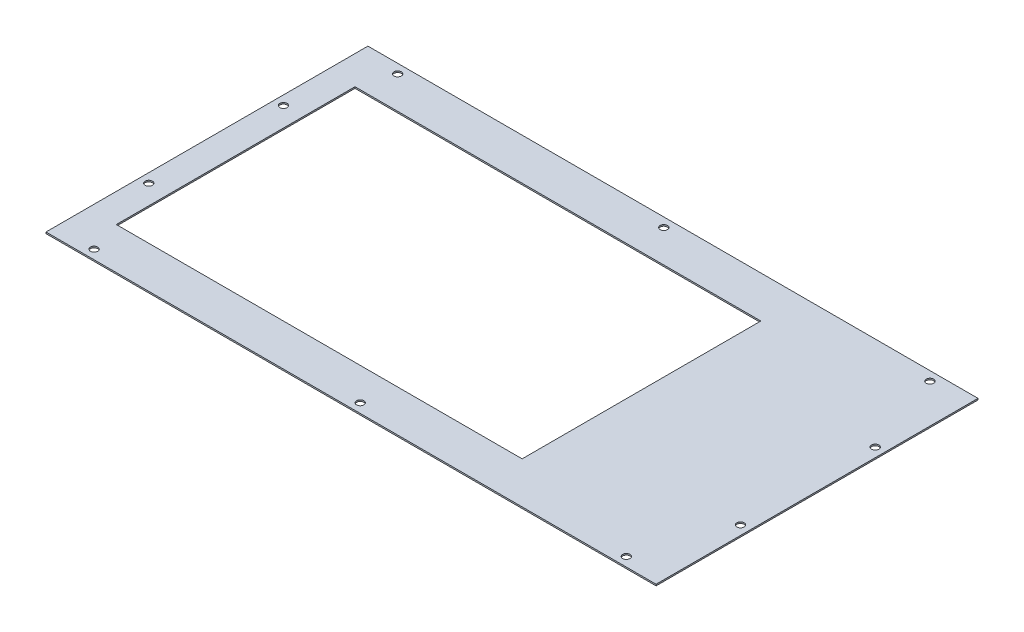
ISO-10303-21;
HEADER;
FILE_DESCRIPTION(('STEP AP214'),'2;1');
FILE_NAME('part.step','',(''),(''),'','','');
FILE_SCHEMA(('AUTOMOTIVE_DESIGN { 1 0 10303 214 1 1 1 1 }'));
ENDSEC;
DATA;
#1=APPLICATION_CONTEXT('core data for automotive mechanical design processes');
#2=APPLICATION_PROTOCOL_DEFINITION('international standard','automotive_design',2000,#1);
#3=PRODUCT_CONTEXT('',#1,'mechanical');
#4=PRODUCT('Part','Part','',(#3));
#5=PRODUCT_RELATED_PRODUCT_CATEGORY('part','',(#4));
#6=PRODUCT_DEFINITION_FORMATION('','',#4);
#7=PRODUCT_DEFINITION_CONTEXT('part definition',#1,'design');
#8=PRODUCT_DEFINITION('design','',#6,#7);
#9=PRODUCT_DEFINITION_SHAPE('','',#8);
#10=(LENGTH_UNIT() NAMED_UNIT(*) SI_UNIT(.MILLI.,.METRE.));
#11=(NAMED_UNIT(*) PLANE_ANGLE_UNIT() SI_UNIT($,.RADIAN.));
#12=(NAMED_UNIT(*) SI_UNIT($,.STERADIAN.) SOLID_ANGLE_UNIT());
#13=UNCERTAINTY_MEASURE_WITH_UNIT(LENGTH_MEASURE(1.E-05),#10,'distance_accuracy_value','');
#14=(GEOMETRIC_REPRESENTATION_CONTEXT(3) GLOBAL_UNCERTAINTY_ASSIGNED_CONTEXT((#13)) GLOBAL_UNIT_ASSIGNED_CONTEXT((#10,
#11,#12)) REPRESENTATION_CONTEXT('',''));
#15=CARTESIAN_POINT('',(0.,0.,0.));
#16=DIRECTION('',(0.,0.,1.));
#17=DIRECTION('',(1.,0.,0.));
#18=AXIS2_PLACEMENT_3D('',#15,#16,#17);
#19=CARTESIAN_POINT('',(166.2,-0.8,87.7));
#20=DIRECTION('',(1.,0.,0.));
#21=DIRECTION('',(0.,0.,-1.));
#22=AXIS2_PLACEMENT_3D('',#19,#20,#21);
#23=PLANE('',#22);
#24=DIRECTION('',(0.,0.,-1.));
#25=VECTOR('',#24,1.);
#26=CARTESIAN_POINT('',(166.2,0.,87.7));
#27=LINE('',#26,#25);
#28=CARTESIAN_POINT('',(166.2,0.,87.7));
#29=VERTEX_POINT('',#28);
#30=CARTESIAN_POINT('',(166.2,0.,-87.7));
#31=VERTEX_POINT('',#30);
#32=EDGE_CURVE('E192',#29,#31,#27,.T.);
#33=ORIENTED_EDGE('',*,*,#32,.F.);
#34=DIRECTION('',(0.,1.,0.));
#35=VECTOR('',#34,1.);
#36=CARTESIAN_POINT('',(166.2,-0.8,87.7));
#37=LINE('',#36,#35);
#38=CARTESIAN_POINT('',(166.2,-0.8,87.7));
#39=VERTEX_POINT('',#38);
#40=EDGE_CURVE('E11',#39,#29,#37,.T.);
#41=ORIENTED_EDGE('',*,*,#40,.F.);
#42=DIRECTION('',(0.,0.,-1.));
#43=VECTOR('',#42,1.);
#44=CARTESIAN_POINT('',(166.2,-0.8,87.7));
#45=LINE('',#44,#43);
#46=CARTESIAN_POINT('',(166.2,-0.8,-87.7));
#47=VERTEX_POINT('',#46);
#48=EDGE_CURVE('E195',#39,#47,#45,.T.);
#49=ORIENTED_EDGE('',*,*,#48,.T.);
#50=DIRECTION('',(0.,1.,0.));
#51=VECTOR('',#50,1.);
#52=CARTESIAN_POINT('',(166.2,-0.8,-87.7));
#53=LINE('',#52,#51);
#54=EDGE_CURVE('E37',#47,#31,#53,.T.);
#55=ORIENTED_EDGE('',*,*,#54,.T.);
#56=EDGE_LOOP('',(#33,#41,#49,#55));
#57=FACE_BOUND('',#56,.T.);
#58=ADVANCED_FACE('F34',(#57),#23,.T.);
#59=CARTESIAN_POINT('',(-166.2,-0.8,87.7));
#60=DIRECTION('',(0.,0.,1.));
#61=DIRECTION('',(1.,0.,0.));
#62=AXIS2_PLACEMENT_3D('',#59,#60,#61);
#63=PLANE('',#62);
#64=DIRECTION('',(1.,0.,0.));
#65=VECTOR('',#64,1.);
#66=CARTESIAN_POINT('',(-166.2,0.,87.7));
#67=LINE('',#66,#65);
#68=CARTESIAN_POINT('',(-166.2,0.,87.7));
#69=VERTEX_POINT('',#68);
#70=EDGE_CURVE('E199',#69,#29,#67,.T.);
#71=ORIENTED_EDGE('',*,*,#70,.F.);
#72=DIRECTION('',(0.,1.,0.));
#73=VECTOR('',#72,1.);
#74=CARTESIAN_POINT('',(-166.2,-0.8,87.7));
#75=LINE('',#74,#73);
#76=CARTESIAN_POINT('',(-166.2,-0.8,87.7));
#77=VERTEX_POINT('',#76);
#78=EDGE_CURVE('E42',#77,#69,#75,.T.);
#79=ORIENTED_EDGE('',*,*,#78,.F.);
#80=DIRECTION('',(1.,0.,0.));
#81=VECTOR('',#80,1.);
#82=CARTESIAN_POINT('',(-166.2,-0.8,87.7));
#83=LINE('',#82,#81);
#84=EDGE_CURVE('E205',#77,#39,#83,.T.);
#85=ORIENTED_EDGE('',*,*,#84,.T.);
#86=ORIENTED_EDGE('',*,*,#40,.T.);
#87=EDGE_LOOP('',(#71,#79,#85,#86));
#88=FACE_BOUND('',#87,.T.);
#89=ADVANCED_FACE('F230',(#88),#63,.T.);
#90=CARTESIAN_POINT('',(-166.2,-0.8,87.7));
#91=DIRECTION('',(-1.,0.,0.));
#92=DIRECTION('',(0.,0.,1.));
#93=AXIS2_PLACEMENT_3D('',#90,#91,#92);
#94=PLANE('',#93);
#95=DIRECTION('',(0.,0.,1.));
#96=VECTOR('',#95,1.);
#97=CARTESIAN_POINT('',(-166.2,0.,87.7));
#98=LINE('',#97,#96);
#99=CARTESIAN_POINT('',(-166.2,0.,-87.7));
#100=VERTEX_POINT('',#99);
#101=EDGE_CURVE('E213',#100,#69,#98,.T.);
#102=ORIENTED_EDGE('',*,*,#101,.F.);
#103=DIRECTION('',(0.,1.,0.));
#104=VECTOR('',#103,1.);
#105=CARTESIAN_POINT('',(-166.2,-0.8,-87.7));
#106=LINE('',#105,#104);
#107=CARTESIAN_POINT('',(-166.2,-0.8,-87.7));
#108=VERTEX_POINT('',#107);
#109=EDGE_CURVE('E218',#108,#100,#106,.T.);
#110=ORIENTED_EDGE('',*,*,#109,.F.);
#111=DIRECTION('',(0.,0.,1.));
#112=VECTOR('',#111,1.);
#113=CARTESIAN_POINT('',(-166.2,-0.8,87.7));
#114=LINE('',#113,#112);
#115=EDGE_CURVE('E202',#108,#77,#114,.T.);
#116=ORIENTED_EDGE('',*,*,#115,.T.);
#117=ORIENTED_EDGE('',*,*,#78,.T.);
#118=EDGE_LOOP('',(#102,#110,#116,#117));
#119=FACE_BOUND('',#118,.T.);
#120=ADVANCED_FACE('F236',(#119),#94,.T.);
#121=CARTESIAN_POINT('',(-166.2,-0.8,-87.7));
#122=DIRECTION('',(0.,0.,-1.));
#123=DIRECTION('',(-1.,0.,0.));
#124=AXIS2_PLACEMENT_3D('',#121,#122,#123);
#125=PLANE('',#124);
#126=DIRECTION('',(-1.,0.,0.));
#127=VECTOR('',#126,1.);
#128=CARTESIAN_POINT('',(-166.2,0.,-87.7));
#129=LINE('',#128,#127);
#130=EDGE_CURVE('E210',#31,#100,#129,.T.);
#131=ORIENTED_EDGE('',*,*,#130,.F.);
#132=ORIENTED_EDGE('',*,*,#54,.F.);
#133=DIRECTION('',(-1.,0.,0.));
#134=VECTOR('',#133,1.);
#135=CARTESIAN_POINT('',(-166.2,-0.8,-87.7));
#136=LINE('',#135,#134);
#137=EDGE_CURVE('E198',#47,#108,#136,.T.);
#138=ORIENTED_EDGE('',*,*,#137,.T.);
#139=ORIENTED_EDGE('',*,*,#109,.T.);
#140=EDGE_LOOP('',(#131,#132,#138,#139));
#141=FACE_BOUND('',#140,.T.);
#142=ADVANCED_FACE('F226',(#141),#125,.T.);
#143=CARTESIAN_POINT('',(166.2,-0.8,-87.7));
#144=DIRECTION('',(0.,-1.,0.));
#145=DIRECTION('',(0.,0.,-1.));
#146=AXIS2_PLACEMENT_3D('',#143,#144,#145);
#147=PLANE('',#146);
#148=DIRECTION('',(0.,0.,1.));
#149=VECTOR('',#148,1.);
#150=CARTESIAN_POINT('',(70.56,-0.8,-87.7));
#151=LINE('',#150,#149);
#152=CARTESIAN_POINT('',(70.56,-0.8,-65.0350000000001));
#153=VERTEX_POINT('',#152);
#154=CARTESIAN_POINT('',(70.56,-0.8,65.0349999999999));
#155=VERTEX_POINT('',#154);
#156=EDGE_CURVE('E132',#153,#155,#151,.T.);
#157=ORIENTED_EDGE('',*,*,#156,.F.);
#158=DIRECTION('',(1.,0.,0.));
#159=VECTOR('',#158,1.);
#160=CARTESIAN_POINT('',(166.2,-0.8,-65.0350000000001));
#161=LINE('',#160,#159);
#162=CARTESIAN_POINT('',(-150.56,-0.8,-65.0350000000001));
#163=VERTEX_POINT('',#162);
#164=EDGE_CURVE('E125',#163,#153,#161,.T.);
#165=ORIENTED_EDGE('',*,*,#164,.F.);
#166=DIRECTION('',(0.,0.,-1.));
#167=VECTOR('',#166,1.);
#168=CARTESIAN_POINT('',(-150.56,-0.8,-87.7));
#169=LINE('',#168,#167);
#170=CARTESIAN_POINT('',(-150.56,-0.8,65.0349999999999));
#171=VERTEX_POINT('',#170);
#172=EDGE_CURVE('E105',#171,#163,#169,.T.);
#173=ORIENTED_EDGE('',*,*,#172,.F.);
#174=DIRECTION('',(-1.,0.,0.));
#175=VECTOR('',#174,1.);
#176=CARTESIAN_POINT('',(166.2,-0.8,65.0349999999999));
#177=LINE('',#176,#175);
#178=EDGE_CURVE('E130',#155,#171,#177,.T.);
#179=ORIENTED_EDGE('',*,*,#178,.F.);
#180=EDGE_LOOP('',(#157,#165,#173,#179));
#181=FACE_BOUND('',#180,.T.);
#182=CARTESIAN_POINT('',(-161.2,-0.8,36.7));
#183=DIRECTION('',(0.,1.,0.));
#184=DIRECTION('',(0.,0.,-1.));
#185=AXIS2_PLACEMENT_3D('',#182,#183,#184);
#186=CIRCLE('',#185,2.);
#187=CARTESIAN_POINT('',(-161.2,-0.8,34.7));
#188=VERTEX_POINT('',#187);
#189=EDGE_CURVE('E135',#188,#188,#186,.T.);
#190=ORIENTED_EDGE('',*,*,#189,.T.);
#191=EDGE_LOOP('',(#190));
#192=FACE_BOUND('',#191,.T.);
#193=CARTESIAN_POINT('',(-145.,-0.8,82.7));
#194=DIRECTION('',(0.,1.,0.));
#195=DIRECTION('',(0.,0.,-1.));
#196=AXIS2_PLACEMENT_3D('',#193,#194,#195);
#197=CIRCLE('',#196,2.);
#198=CARTESIAN_POINT('',(-145.,-0.8,80.7));
#199=VERTEX_POINT('',#198);
#200=EDGE_CURVE('E141',#199,#199,#197,.T.);
#201=ORIENTED_EDGE('',*,*,#200,.T.);
#202=EDGE_LOOP('',(#201));
#203=FACE_BOUND('',#202,.T.);
#204=CARTESIAN_POINT('',(0.,-0.8,82.7));
#205=DIRECTION('',(0.,1.,0.));
#206=DIRECTION('',(0.,0.,-1.));
#207=AXIS2_PLACEMENT_3D('',#204,#205,#206);
#208=CIRCLE('',#207,2.);
#209=CARTESIAN_POINT('',(0.,-0.8,80.7));
#210=VERTEX_POINT('',#209);
#211=EDGE_CURVE('E147',#210,#210,#208,.T.);
#212=ORIENTED_EDGE('',*,*,#211,.T.);
#213=EDGE_LOOP('',(#212));
#214=FACE_BOUND('',#213,.T.);
#215=CARTESIAN_POINT('',(145.,-0.8,82.7));
#216=DIRECTION('',(0.,1.,0.));
#217=DIRECTION('',(0.,0.,-1.));
#218=AXIS2_PLACEMENT_3D('',#215,#216,#217);
#219=CIRCLE('',#218,2.);
#220=CARTESIAN_POINT('',(145.,-0.8,80.7));
#221=VERTEX_POINT('',#220);
#222=EDGE_CURVE('E153',#221,#221,#219,.T.);
#223=ORIENTED_EDGE('',*,*,#222,.T.);
#224=EDGE_LOOP('',(#223));
#225=FACE_BOUND('',#224,.T.);
#226=CARTESIAN_POINT('',(161.2,-0.8,36.7));
#227=DIRECTION('',(0.,1.,0.));
#228=DIRECTION('',(0.,0.,1.));
#229=AXIS2_PLACEMENT_3D('',#226,#227,#228);
#230=CIRCLE('',#229,2.);
#231=CARTESIAN_POINT('',(161.2,-0.8,38.7));
#232=VERTEX_POINT('',#231);
#233=EDGE_CURVE('E159',#232,#232,#230,.T.);
#234=ORIENTED_EDGE('',*,*,#233,.T.);
#235=EDGE_LOOP('',(#234));
#236=FACE_BOUND('',#235,.T.);
#237=CARTESIAN_POINT('',(161.2,-0.8,-36.7));
#238=DIRECTION('',(0.,1.,0.));
#239=DIRECTION('',(0.,0.,-1.));
#240=AXIS2_PLACEMENT_3D('',#237,#238,#239);
#241=CIRCLE('',#240,2.);
#242=CARTESIAN_POINT('',(161.2,-0.8,-38.7));
#243=VERTEX_POINT('',#242);
#244=EDGE_CURVE('E165',#243,#243,#241,.T.);
#245=ORIENTED_EDGE('',*,*,#244,.T.);
#246=EDGE_LOOP('',(#245));
#247=FACE_BOUND('',#246,.T.);
#248=CARTESIAN_POINT('',(-161.2,-0.8,-36.7));
#249=DIRECTION('',(0.,1.,0.));
#250=DIRECTION('',(0.,0.,1.));
#251=AXIS2_PLACEMENT_3D('',#248,#249,#250);
#252=CIRCLE('',#251,2.);
#253=CARTESIAN_POINT('',(-161.2,-0.8,-34.7));
#254=VERTEX_POINT('',#253);
#255=EDGE_CURVE('E171',#254,#254,#252,.T.);
#256=ORIENTED_EDGE('',*,*,#255,.T.);
#257=EDGE_LOOP('',(#256));
#258=FACE_BOUND('',#257,.T.);
#259=CARTESIAN_POINT('',(-145.,-0.8,-82.7));
#260=DIRECTION('',(0.,1.,0.));
#261=DIRECTION('',(0.,0.,1.));
#262=AXIS2_PLACEMENT_3D('',#259,#260,#261);
#263=CIRCLE('',#262,2.);
#264=CARTESIAN_POINT('',(-145.,-0.8,-80.7));
#265=VERTEX_POINT('',#264);
#266=EDGE_CURVE('E177',#265,#265,#263,.T.);
#267=ORIENTED_EDGE('',*,*,#266,.T.);
#268=EDGE_LOOP('',(#267));
#269=FACE_BOUND('',#268,.T.);
#270=CARTESIAN_POINT('',(145.,-0.8,-82.7));
#271=DIRECTION('',(0.,1.,0.));
#272=DIRECTION('',(0.,0.,1.));
#273=AXIS2_PLACEMENT_3D('',#270,#271,#272);
#274=CIRCLE('',#273,2.);
#275=CARTESIAN_POINT('',(145.,-0.8,-80.7));
#276=VERTEX_POINT('',#275);
#277=EDGE_CURVE('E183',#276,#276,#274,.T.);
#278=ORIENTED_EDGE('',*,*,#277,.T.);
#279=EDGE_LOOP('',(#278));
#280=FACE_BOUND('',#279,.T.);
#281=CARTESIAN_POINT('',(0.,-0.8,-82.7));
#282=DIRECTION('',(0.,1.,0.));
#283=DIRECTION('',(0.,0.,1.));
#284=AXIS2_PLACEMENT_3D('',#281,#282,#283);
#285=CIRCLE('',#284,2.);
#286=CARTESIAN_POINT('',(0.,-0.8,-80.7));
#287=VERTEX_POINT('',#286);
#288=EDGE_CURVE('E189',#287,#287,#285,.T.);
#289=ORIENTED_EDGE('',*,*,#288,.T.);
#290=EDGE_LOOP('',(#289));
#291=FACE_BOUND('',#290,.T.);
#292=ORIENTED_EDGE('',*,*,#48,.F.);
#293=ORIENTED_EDGE('',*,*,#84,.F.);
#294=ORIENTED_EDGE('',*,*,#115,.F.);
#295=ORIENTED_EDGE('',*,*,#137,.F.);
#296=EDGE_LOOP('',(#292,#293,#294,#295));
#297=FACE_BOUND('',#296,.T.);
#298=ADVANCED_FACE('F233',(#181,#192,#203,#214,#225,#236,#247,#258,#269,#280,#291,#297),#147,.T.);
#299=CARTESIAN_POINT('',(166.2,0.,-87.7));
#300=DIRECTION('',(0.,-1.,0.));
#301=DIRECTION('',(0.,0.,-1.));
#302=AXIS2_PLACEMENT_3D('',#299,#300,#301);
#303=PLANE('',#302);
#304=DIRECTION('',(-1.,0.,0.));
#305=VECTOR('',#304,1.);
#306=CARTESIAN_POINT('',(-150.56,0.,-65.0350000000001));
#307=LINE('',#306,#305);
#308=CARTESIAN_POINT('',(70.56,0.,-65.0350000000001));
#309=VERTEX_POINT('',#308);
#310=CARTESIAN_POINT('',(-150.56,0.,-65.0350000000001));
#311=VERTEX_POINT('',#310);
#312=EDGE_CURVE('E111',#309,#311,#307,.T.);
#313=ORIENTED_EDGE('',*,*,#312,.F.);
#314=DIRECTION('',(0.,0.,-1.));
#315=VECTOR('',#314,1.);
#316=CARTESIAN_POINT('',(70.56,0.,-65.0350000000001));
#317=LINE('',#316,#315);
#318=CARTESIAN_POINT('',(70.56,0.,65.0349999999999));
#319=VERTEX_POINT('',#318);
#320=EDGE_CURVE('E58',#319,#309,#317,.T.);
#321=ORIENTED_EDGE('',*,*,#320,.F.);
#322=DIRECTION('',(1.,0.,0.));
#323=VECTOR('',#322,1.);
#324=CARTESIAN_POINT('',(-150.56,0.,65.0349999999999));
#325=LINE('',#324,#323);
#326=CARTESIAN_POINT('',(-150.56,0.,65.0349999999999));
#327=VERTEX_POINT('',#326);
#328=EDGE_CURVE('E118',#327,#319,#325,.T.);
#329=ORIENTED_EDGE('',*,*,#328,.F.);
#330=DIRECTION('',(0.,0.,1.));
#331=VECTOR('',#330,1.);
#332=CARTESIAN_POINT('',(-150.56,0.,-65.0350000000001));
#333=LINE('',#332,#331);
#334=EDGE_CURVE('E102',#311,#327,#333,.T.);
#335=ORIENTED_EDGE('',*,*,#334,.F.);
#336=EDGE_LOOP('',(#313,#321,#329,#335));
#337=FACE_BOUND('',#336,.T.);
#338=CARTESIAN_POINT('',(-161.2,0.,36.7));
#339=DIRECTION('',(0.,1.,0.));
#340=DIRECTION('',(0.,0.,-1.));
#341=AXIS2_PLACEMENT_3D('',#338,#339,#340);
#342=CIRCLE('',#341,2.);
#343=CARTESIAN_POINT('',(-161.2,0.,34.7));
#344=VERTEX_POINT('',#343);
#345=EDGE_CURVE('E134',#344,#344,#342,.T.);
#346=ORIENTED_EDGE('',*,*,#345,.F.);
#347=EDGE_LOOP('',(#346));
#348=FACE_BOUND('',#347,.T.);
#349=CARTESIAN_POINT('',(-145.,0.,82.7));
#350=DIRECTION('',(0.,1.,0.));
#351=DIRECTION('',(0.,0.,-1.));
#352=AXIS2_PLACEMENT_3D('',#349,#350,#351);
#353=CIRCLE('',#352,2.);
#354=CARTESIAN_POINT('',(-145.,0.,80.7));
#355=VERTEX_POINT('',#354);
#356=EDGE_CURVE('E138',#355,#355,#353,.T.);
#357=ORIENTED_EDGE('',*,*,#356,.F.);
#358=EDGE_LOOP('',(#357));
#359=FACE_BOUND('',#358,.T.);
#360=CARTESIAN_POINT('',(0.,0.,82.7));
#361=DIRECTION('',(0.,1.,0.));
#362=DIRECTION('',(0.,0.,-1.));
#363=AXIS2_PLACEMENT_3D('',#360,#361,#362);
#364=CIRCLE('',#363,2.);
#365=CARTESIAN_POINT('',(0.,0.,80.7));
#366=VERTEX_POINT('',#365);
#367=EDGE_CURVE('E144',#366,#366,#364,.T.);
#368=ORIENTED_EDGE('',*,*,#367,.F.);
#369=EDGE_LOOP('',(#368));
#370=FACE_BOUND('',#369,.T.);
#371=CARTESIAN_POINT('',(145.,0.,82.7));
#372=DIRECTION('',(0.,1.,0.));
#373=DIRECTION('',(0.,0.,-1.));
#374=AXIS2_PLACEMENT_3D('',#371,#372,#373);
#375=CIRCLE('',#374,2.);
#376=CARTESIAN_POINT('',(145.,0.,80.7));
#377=VERTEX_POINT('',#376);
#378=EDGE_CURVE('E150',#377,#377,#375,.T.);
#379=ORIENTED_EDGE('',*,*,#378,.F.);
#380=EDGE_LOOP('',(#379));
#381=FACE_BOUND('',#380,.T.);
#382=CARTESIAN_POINT('',(161.2,0.,36.7));
#383=DIRECTION('',(0.,1.,0.));
#384=DIRECTION('',(0.,0.,1.));
#385=AXIS2_PLACEMENT_3D('',#382,#383,#384);
#386=CIRCLE('',#385,2.);
#387=CARTESIAN_POINT('',(161.2,0.,38.7));
#388=VERTEX_POINT('',#387);
#389=EDGE_CURVE('E156',#388,#388,#386,.T.);
#390=ORIENTED_EDGE('',*,*,#389,.F.);
#391=EDGE_LOOP('',(#390));
#392=FACE_BOUND('',#391,.T.);
#393=CARTESIAN_POINT('',(161.2,0.,-36.7));
#394=DIRECTION('',(0.,1.,0.));
#395=DIRECTION('',(0.,0.,-1.));
#396=AXIS2_PLACEMENT_3D('',#393,#394,#395);
#397=CIRCLE('',#396,2.);
#398=CARTESIAN_POINT('',(161.2,0.,-38.7));
#399=VERTEX_POINT('',#398);
#400=EDGE_CURVE('E162',#399,#399,#397,.T.);
#401=ORIENTED_EDGE('',*,*,#400,.F.);
#402=EDGE_LOOP('',(#401));
#403=FACE_BOUND('',#402,.T.);
#404=CARTESIAN_POINT('',(-161.2,0.,-36.7));
#405=DIRECTION('',(0.,1.,0.));
#406=DIRECTION('',(0.,0.,1.));
#407=AXIS2_PLACEMENT_3D('',#404,#405,#406);
#408=CIRCLE('',#407,2.);
#409=CARTESIAN_POINT('',(-161.2,0.,-34.7));
#410=VERTEX_POINT('',#409);
#411=EDGE_CURVE('E168',#410,#410,#408,.T.);
#412=ORIENTED_EDGE('',*,*,#411,.F.);
#413=EDGE_LOOP('',(#412));
#414=FACE_BOUND('',#413,.T.);
#415=CARTESIAN_POINT('',(-145.,0.,-82.7));
#416=DIRECTION('',(0.,1.,0.));
#417=DIRECTION('',(0.,0.,1.));
#418=AXIS2_PLACEMENT_3D('',#415,#416,#417);
#419=CIRCLE('',#418,2.);
#420=CARTESIAN_POINT('',(-145.,0.,-80.7));
#421=VERTEX_POINT('',#420);
#422=EDGE_CURVE('E174',#421,#421,#419,.T.);
#423=ORIENTED_EDGE('',*,*,#422,.F.);
#424=EDGE_LOOP('',(#423));
#425=FACE_BOUND('',#424,.T.);
#426=CARTESIAN_POINT('',(145.,0.,-82.7));
#427=DIRECTION('',(0.,1.,0.));
#428=DIRECTION('',(0.,0.,1.));
#429=AXIS2_PLACEMENT_3D('',#426,#427,#428);
#430=CIRCLE('',#429,2.);
#431=CARTESIAN_POINT('',(145.,0.,-80.7));
#432=VERTEX_POINT('',#431);
#433=EDGE_CURVE('E180',#432,#432,#430,.T.);
#434=ORIENTED_EDGE('',*,*,#433,.F.);
#435=EDGE_LOOP('',(#434));
#436=FACE_BOUND('',#435,.T.);
#437=CARTESIAN_POINT('',(0.,0.,-82.7));
#438=DIRECTION('',(0.,1.,0.));
#439=DIRECTION('',(0.,0.,1.));
#440=AXIS2_PLACEMENT_3D('',#437,#438,#439);
#441=CIRCLE('',#440,2.);
#442=CARTESIAN_POINT('',(0.,0.,-80.7));
#443=VERTEX_POINT('',#442);
#444=EDGE_CURVE('E186',#443,#443,#441,.T.);
#445=ORIENTED_EDGE('',*,*,#444,.F.);
#446=EDGE_LOOP('',(#445));
#447=FACE_BOUND('',#446,.T.);
#448=ORIENTED_EDGE('',*,*,#32,.T.);
#449=ORIENTED_EDGE('',*,*,#130,.T.);
#450=ORIENTED_EDGE('',*,*,#101,.T.);
#451=ORIENTED_EDGE('',*,*,#70,.T.);
#452=EDGE_LOOP('',(#448,#449,#450,#451));
#453=FACE_BOUND('',#452,.T.);
#454=ADVANCED_FACE('F115',(#337,#348,#359,#370,#381,#392,#403,#414,#425,#436,#447,#453),#303,.F.);
#455=CARTESIAN_POINT('',(0.,-0.8,-82.7));
#456=DIRECTION('',(0.,1.,0.));
#457=DIRECTION('',(0.,0.,1.));
#458=AXIS2_PLACEMENT_3D('',#455,#456,#457);
#459=CYLINDRICAL_SURFACE('',#458,2.);
#460=ORIENTED_EDGE('',*,*,#288,.F.);
#461=EDGE_LOOP('',(#460));
#462=FACE_BOUND('',#461,.T.);
#463=ORIENTED_EDGE('',*,*,#444,.T.);
#464=EDGE_LOOP('',(#463));
#465=FACE_BOUND('',#464,.T.);
#466=ADVANCED_FACE('F271',(#462,#465),#459,.F.);
#467=CARTESIAN_POINT('',(145.,-0.8,-82.7));
#468=DIRECTION('',(0.,1.,0.));
#469=DIRECTION('',(0.,0.,1.));
#470=AXIS2_PLACEMENT_3D('',#467,#468,#469);
#471=CYLINDRICAL_SURFACE('',#470,2.);
#472=ORIENTED_EDGE('',*,*,#277,.F.);
#473=EDGE_LOOP('',(#472));
#474=FACE_BOUND('',#473,.T.);
#475=ORIENTED_EDGE('',*,*,#433,.T.);
#476=EDGE_LOOP('',(#475));
#477=FACE_BOUND('',#476,.T.);
#478=ADVANCED_FACE('F276',(#474,#477),#471,.F.);
#479=CARTESIAN_POINT('',(-145.,-0.8,-82.7));
#480=DIRECTION('',(0.,1.,0.));
#481=DIRECTION('',(0.,0.,1.));
#482=AXIS2_PLACEMENT_3D('',#479,#480,#481);
#483=CYLINDRICAL_SURFACE('',#482,2.);
#484=ORIENTED_EDGE('',*,*,#266,.F.);
#485=EDGE_LOOP('',(#484));
#486=FACE_BOUND('',#485,.T.);
#487=ORIENTED_EDGE('',*,*,#422,.T.);
#488=EDGE_LOOP('',(#487));
#489=FACE_BOUND('',#488,.T.);
#490=ADVANCED_FACE('F289',(#486,#489),#483,.F.);
#491=CARTESIAN_POINT('',(-161.2,-0.8,-36.7));
#492=DIRECTION('',(0.,1.,0.));
#493=DIRECTION('',(0.,0.,1.));
#494=AXIS2_PLACEMENT_3D('',#491,#492,#493);
#495=CYLINDRICAL_SURFACE('',#494,2.);
#496=ORIENTED_EDGE('',*,*,#255,.F.);
#497=EDGE_LOOP('',(#496));
#498=FACE_BOUND('',#497,.T.);
#499=ORIENTED_EDGE('',*,*,#411,.T.);
#500=EDGE_LOOP('',(#499));
#501=FACE_BOUND('',#500,.T.);
#502=ADVANCED_FACE('F300',(#498,#501),#495,.F.);
#503=CARTESIAN_POINT('',(161.2,-0.8,-36.7));
#504=DIRECTION('',(0.,1.,0.));
#505=DIRECTION('',(0.,0.,1.));
#506=AXIS2_PLACEMENT_3D('',#503,#504,#505);
#507=CYLINDRICAL_SURFACE('',#506,2.);
#508=ORIENTED_EDGE('',*,*,#244,.F.);
#509=EDGE_LOOP('',(#508));
#510=FACE_BOUND('',#509,.T.);
#511=ORIENTED_EDGE('',*,*,#400,.T.);
#512=EDGE_LOOP('',(#511));
#513=FACE_BOUND('',#512,.T.);
#514=ADVANCED_FACE('F311',(#510,#513),#507,.F.);
#515=CARTESIAN_POINT('',(161.2,-0.8,36.7));
#516=DIRECTION('',(0.,1.,0.));
#517=DIRECTION('',(0.,0.,1.));
#518=AXIS2_PLACEMENT_3D('',#515,#516,#517);
#519=CYLINDRICAL_SURFACE('',#518,2.);
#520=ORIENTED_EDGE('',*,*,#233,.F.);
#521=EDGE_LOOP('',(#520));
#522=FACE_BOUND('',#521,.T.);
#523=ORIENTED_EDGE('',*,*,#389,.T.);
#524=EDGE_LOOP('',(#523));
#525=FACE_BOUND('',#524,.T.);
#526=ADVANCED_FACE('F322',(#522,#525),#519,.F.);
#527=CARTESIAN_POINT('',(145.,-0.8,82.7));
#528=DIRECTION('',(0.,1.,0.));
#529=DIRECTION('',(0.,0.,1.));
#530=AXIS2_PLACEMENT_3D('',#527,#528,#529);
#531=CYLINDRICAL_SURFACE('',#530,2.);
#532=ORIENTED_EDGE('',*,*,#222,.F.);
#533=EDGE_LOOP('',(#532));
#534=FACE_BOUND('',#533,.T.);
#535=ORIENTED_EDGE('',*,*,#378,.T.);
#536=EDGE_LOOP('',(#535));
#537=FACE_BOUND('',#536,.T.);
#538=ADVANCED_FACE('F333',(#534,#537),#531,.F.);
#539=CARTESIAN_POINT('',(0.,-0.8,82.7));
#540=DIRECTION('',(0.,1.,0.));
#541=DIRECTION('',(0.,0.,1.));
#542=AXIS2_PLACEMENT_3D('',#539,#540,#541);
#543=CYLINDRICAL_SURFACE('',#542,2.);
#544=ORIENTED_EDGE('',*,*,#211,.F.);
#545=EDGE_LOOP('',(#544));
#546=FACE_BOUND('',#545,.T.);
#547=ORIENTED_EDGE('',*,*,#367,.T.);
#548=EDGE_LOOP('',(#547));
#549=FACE_BOUND('',#548,.T.);
#550=ADVANCED_FACE('F344',(#546,#549),#543,.F.);
#551=CARTESIAN_POINT('',(-145.,-0.8,82.7));
#552=DIRECTION('',(0.,1.,0.));
#553=DIRECTION('',(0.,0.,1.));
#554=AXIS2_PLACEMENT_3D('',#551,#552,#553);
#555=CYLINDRICAL_SURFACE('',#554,2.);
#556=ORIENTED_EDGE('',*,*,#200,.F.);
#557=EDGE_LOOP('',(#556));
#558=FACE_BOUND('',#557,.T.);
#559=ORIENTED_EDGE('',*,*,#356,.T.);
#560=EDGE_LOOP('',(#559));
#561=FACE_BOUND('',#560,.T.);
#562=ADVANCED_FACE('F355',(#558,#561),#555,.F.);
#563=CARTESIAN_POINT('',(-161.2,-0.8,36.7));
#564=DIRECTION('',(0.,1.,0.));
#565=DIRECTION('',(0.,0.,1.));
#566=AXIS2_PLACEMENT_3D('',#563,#564,#565);
#567=CYLINDRICAL_SURFACE('',#566,2.);
#568=ORIENTED_EDGE('',*,*,#189,.F.);
#569=EDGE_LOOP('',(#568));
#570=FACE_BOUND('',#569,.T.);
#571=ORIENTED_EDGE('',*,*,#345,.T.);
#572=EDGE_LOOP('',(#571));
#573=FACE_BOUND('',#572,.T.);
#574=ADVANCED_FACE('F366',(#570,#573),#567,.F.);
#575=CARTESIAN_POINT('',(70.56,-10.,-65.0350000000001));
#576=DIRECTION('',(1.,0.,0.));
#577=DIRECTION('',(0.,0.,-1.));
#578=AXIS2_PLACEMENT_3D('',#575,#576,#577);
#579=PLANE('',#578);
#580=ORIENTED_EDGE('',*,*,#156,.T.);
#581=DIRECTION('',(0.,1.,0.));
#582=VECTOR('',#581,1.);
#583=CARTESIAN_POINT('',(70.56,-10.,65.0349999999999));
#584=LINE('',#583,#582);
#585=EDGE_CURVE('E123',#155,#319,#584,.T.);
#586=ORIENTED_EDGE('',*,*,#585,.T.);
#587=ORIENTED_EDGE('',*,*,#320,.T.);
#588=DIRECTION('',(0.,1.,0.));
#589=VECTOR('',#588,1.);
#590=CARTESIAN_POINT('',(70.56,-10.,-65.0350000000001));
#591=LINE('',#590,#589);
#592=EDGE_CURVE('E108',#153,#309,#591,.T.);
#593=ORIENTED_EDGE('',*,*,#592,.F.);
#594=EDGE_LOOP('',(#580,#586,#587,#593));
#595=FACE_BOUND('',#594,.T.);
#596=ADVANCED_FACE('F377',(#595),#579,.F.);
#597=CARTESIAN_POINT('',(-150.56,-10.,65.0349999999999));
#598=DIRECTION('',(0.,0.,1.));
#599=DIRECTION('',(1.,0.,0.));
#600=AXIS2_PLACEMENT_3D('',#597,#598,#599);
#601=PLANE('',#600);
#602=ORIENTED_EDGE('',*,*,#178,.T.);
#603=DIRECTION('',(0.,1.,0.));
#604=VECTOR('',#603,1.);
#605=CARTESIAN_POINT('',(-150.56,-10.,65.0349999999999));
#606=LINE('',#605,#604);
#607=EDGE_CURVE('E107',#171,#327,#606,.T.);
#608=ORIENTED_EDGE('',*,*,#607,.T.);
#609=ORIENTED_EDGE('',*,*,#328,.T.);
#610=ORIENTED_EDGE('',*,*,#585,.F.);
#611=EDGE_LOOP('',(#602,#608,#609,#610));
#612=FACE_BOUND('',#611,.T.);
#613=ADVANCED_FACE('F403',(#612),#601,.F.);
#614=CARTESIAN_POINT('',(-150.56,-10.,-65.0350000000001));
#615=DIRECTION('',(-1.,0.,0.));
#616=DIRECTION('',(0.,0.,1.));
#617=AXIS2_PLACEMENT_3D('',#614,#615,#616);
#618=PLANE('',#617);
#619=ORIENTED_EDGE('',*,*,#172,.T.);
#620=DIRECTION('',(0.,1.,0.));
#621=VECTOR('',#620,1.);
#622=CARTESIAN_POINT('',(-150.56,-10.,-65.0350000000001));
#623=LINE('',#622,#621);
#624=EDGE_CURVE('E50',#163,#311,#623,.T.);
#625=ORIENTED_EDGE('',*,*,#624,.T.);
#626=ORIENTED_EDGE('',*,*,#334,.T.);
#627=ORIENTED_EDGE('',*,*,#607,.F.);
#628=EDGE_LOOP('',(#619,#625,#626,#627));
#629=FACE_BOUND('',#628,.T.);
#630=ADVANCED_FACE('F99',(#629),#618,.F.);
#631=CARTESIAN_POINT('',(-150.56,-10.,-65.0350000000001));
#632=DIRECTION('',(0.,0.,-1.));
#633=DIRECTION('',(-1.,0.,0.));
#634=AXIS2_PLACEMENT_3D('',#631,#632,#633);
#635=PLANE('',#634);
#636=ORIENTED_EDGE('',*,*,#164,.T.);
#637=ORIENTED_EDGE('',*,*,#592,.T.);
#638=ORIENTED_EDGE('',*,*,#312,.T.);
#639=ORIENTED_EDGE('',*,*,#624,.F.);
#640=EDGE_LOOP('',(#636,#637,#638,#639));
#641=FACE_BOUND('',#640,.T.);
#642=ADVANCED_FACE('F112',(#641),#635,.F.);
#643=CLOSED_SHELL('',(#58,#89,#120,#142,#298,#454,#466,#478,#490,#502,#514,#526,#538,#550,#562,
#574,#596,#613,#630,#642));
#644=MANIFOLD_SOLID_BREP('B2',#643);
#645=ADVANCED_BREP_SHAPE_REPRESENTATION('',(#18,#644),#14);
#646=SHAPE_DEFINITION_REPRESENTATION(#9,#645);
ENDSEC;
END-ISO-10303-21;
